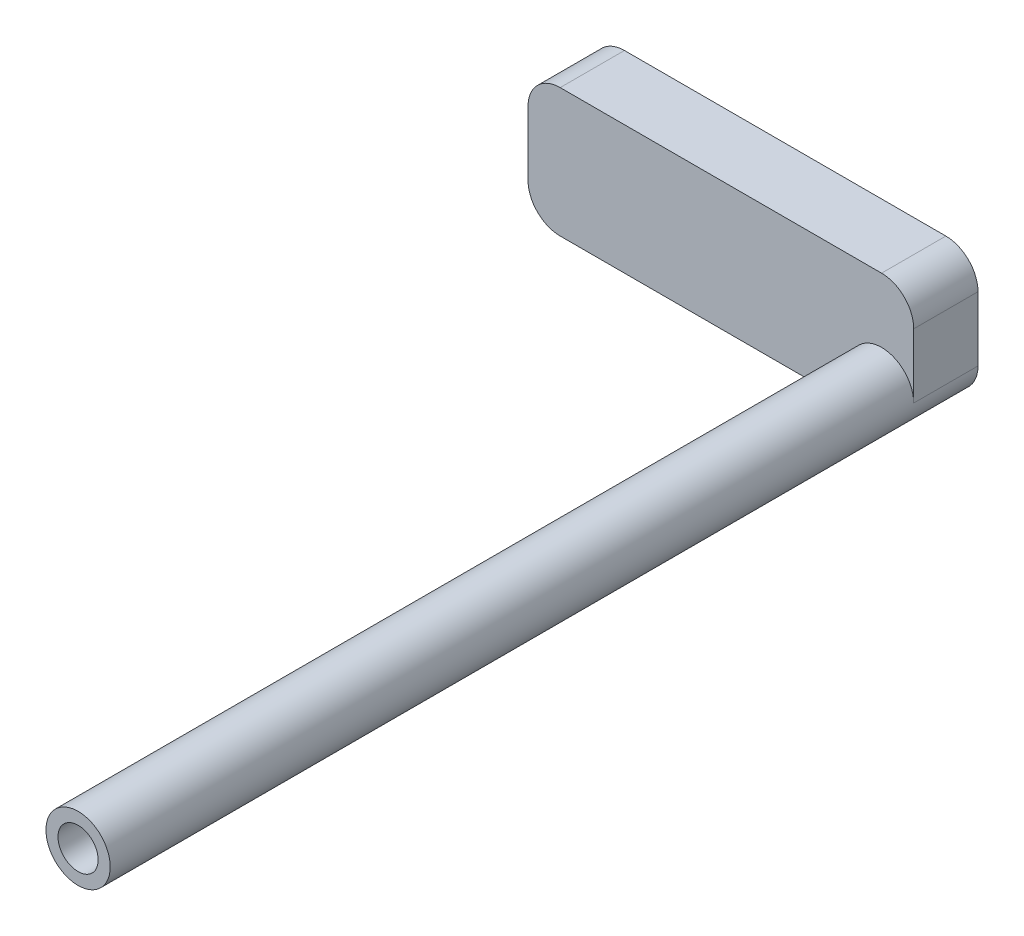
ISO-10303-21;
HEADER;
FILE_DESCRIPTION(('STEP AP214'),'2;1');
FILE_NAME('part.step','',(''),(''),'','','');
FILE_SCHEMA(('AUTOMOTIVE_DESIGN { 1 0 10303 214 1 1 1 1 }'));
ENDSEC;
DATA;
#1=APPLICATION_CONTEXT('core data for automotive mechanical design processes');
#2=APPLICATION_PROTOCOL_DEFINITION('international standard','automotive_design',2000,#1);
#3=PRODUCT_CONTEXT('',#1,'mechanical');
#4=PRODUCT('Part','Part','',(#3));
#5=PRODUCT_RELATED_PRODUCT_CATEGORY('part','',(#4));
#6=PRODUCT_DEFINITION_FORMATION('','',#4);
#7=PRODUCT_DEFINITION_CONTEXT('part definition',#1,'design');
#8=PRODUCT_DEFINITION('design','',#6,#7);
#9=PRODUCT_DEFINITION_SHAPE('','',#8);
#10=(LENGTH_UNIT() NAMED_UNIT(*) SI_UNIT(.MILLI.,.METRE.));
#11=(NAMED_UNIT(*) PLANE_ANGLE_UNIT() SI_UNIT($,.RADIAN.));
#12=(NAMED_UNIT(*) SI_UNIT($,.STERADIAN.) SOLID_ANGLE_UNIT());
#13=UNCERTAINTY_MEASURE_WITH_UNIT(LENGTH_MEASURE(1.E-05),#10,'distance_accuracy_value','');
#14=(GEOMETRIC_REPRESENTATION_CONTEXT(3) GLOBAL_UNCERTAINTY_ASSIGNED_CONTEXT((#13)) GLOBAL_UNIT_ASSIGNED_CONTEXT((#10,
#11,#12)) REPRESENTATION_CONTEXT('',''));
#15=CARTESIAN_POINT('',(0.,0.,0.));
#16=DIRECTION('',(0.,0.,1.));
#17=DIRECTION('',(1.,0.,0.));
#18=AXIS2_PLACEMENT_3D('',#15,#16,#17);
#19=CARTESIAN_POINT('',(0.,0.,5.));
#20=DIRECTION('',(0.,0.,-1.));
#21=DIRECTION('',(-1.,0.,0.));
#22=AXIS2_PLACEMENT_3D('',#19,#20,#21);
#23=CYLINDRICAL_SURFACE('',#22,4.);
#24=CARTESIAN_POINT('',(0.,0.,-100.));
#25=DIRECTION('',(0.,0.,1.));
#26=DIRECTION('',(1.,0.,0.));
#27=AXIS2_PLACEMENT_3D('',#24,#25,#26);
#28=CIRCLE('',#27,4.);
#29=CARTESIAN_POINT('',(4.,0.,-100.));
#30=VERTEX_POINT('',#29);
#31=CARTESIAN_POINT('',(0.,-4.,-100.));
#32=VERTEX_POINT('',#31);
#33=EDGE_CURVE('E11',#30,#32,#28,.T.);
#34=ORIENTED_EDGE('',*,*,#33,.T.);
#35=DIRECTION('',(0.,0.,1.));
#36=VECTOR('',#35,1.);
#37=CARTESIAN_POINT('',(0.,-4.,-108.));
#38=LINE('',#37,#36);
#39=CARTESIAN_POINT('',(0.,-4.,-108.));
#40=VERTEX_POINT('',#39);
#41=EDGE_CURVE('E184',#40,#32,#38,.T.);
#42=ORIENTED_EDGE('',*,*,#41,.F.);
#43=CARTESIAN_POINT('',(0.,0.,-108.));
#44=DIRECTION('',(0.,0.,-1.));
#45=DIRECTION('',(-1.,0.,0.));
#46=AXIS2_PLACEMENT_3D('',#43,#44,#45);
#47=CIRCLE('',#46,4.);
#48=CARTESIAN_POINT('',(4.,0.,-108.));
#49=VERTEX_POINT('',#48);
#50=EDGE_CURVE('E214',#49,#40,#47,.T.);
#51=ORIENTED_EDGE('',*,*,#50,.F.);
#52=DIRECTION('',(0.,0.,1.));
#53=VECTOR('',#52,1.);
#54=CARTESIAN_POINT('',(4.,0.,-108.));
#55=LINE('',#54,#53);
#56=EDGE_CURVE('E60',#49,#30,#55,.T.);
#57=ORIENTED_EDGE('',*,*,#56,.T.);
#58=EDGE_LOOP('',(#34,#42,#51,#57));
#59=FACE_BOUND('',#58,.T.);
#60=CARTESIAN_POINT('',(0.,0.,0.));
#61=DIRECTION('',(0.,0.,1.));
#62=DIRECTION('',(1.,0.,0.));
#63=AXIS2_PLACEMENT_3D('',#60,#61,#62);
#64=CIRCLE('',#63,4.);
#65=CARTESIAN_POINT('',(4.,0.,0.));
#66=VERTEX_POINT('',#65);
#67=EDGE_CURVE('E192',#66,#66,#64,.T.);
#68=ORIENTED_EDGE('',*,*,#67,.F.);
#69=EDGE_LOOP('',(#68));
#70=FACE_BOUND('',#69,.T.);
#71=ADVANCED_FACE('F45',(#59,#70),#23,.T.);
#72=CARTESIAN_POINT('',(0.,0.,-100.));
#73=DIRECTION('',(0.,0.,1.));
#74=DIRECTION('',(1.,0.,0.));
#75=AXIS2_PLACEMENT_3D('',#72,#73,#74);
#76=CYLINDRICAL_SURFACE('',#75,2.5);
#77=CARTESIAN_POINT('',(0.,0.,-100.));
#78=DIRECTION('',(0.,0.,1.));
#79=DIRECTION('',(1.,0.,0.));
#80=AXIS2_PLACEMENT_3D('',#77,#78,#79);
#81=CIRCLE('',#80,2.5);
#82=CARTESIAN_POINT('',(2.5,0.,-100.));
#83=VERTEX_POINT('',#82);
#84=EDGE_CURVE('E54',#83,#83,#81,.T.);
#85=ORIENTED_EDGE('',*,*,#84,.F.);
#86=EDGE_LOOP('',(#85));
#87=FACE_BOUND('',#86,.T.);
#88=CARTESIAN_POINT('',(0.,0.,0.));
#89=DIRECTION('',(0.,0.,1.));
#90=DIRECTION('',(1.,0.,0.));
#91=AXIS2_PLACEMENT_3D('',#88,#89,#90);
#92=CIRCLE('',#91,2.5);
#93=CARTESIAN_POINT('',(2.5,0.,0.));
#94=VERTEX_POINT('',#93);
#95=EDGE_CURVE('E48',#94,#94,#92,.F.);
#96=ORIENTED_EDGE('',*,*,#95,.F.);
#97=EDGE_LOOP('',(#96));
#98=FACE_BOUND('',#97,.T.);
#99=ADVANCED_FACE('F201',(#87,#98),#76,.F.);
#100=CARTESIAN_POINT('',(0.,0.,0.));
#101=DIRECTION('',(0.,0.,1.));
#102=DIRECTION('',(1.,0.,0.));
#103=AXIS2_PLACEMENT_3D('',#100,#101,#102);
#104=PLANE('',#103);
#105=ORIENTED_EDGE('',*,*,#95,.T.);
#106=EDGE_LOOP('',(#105));
#107=FACE_BOUND('',#106,.T.);
#108=ORIENTED_EDGE('',*,*,#67,.T.);
#109=EDGE_LOOP('',(#108));
#110=FACE_BOUND('',#109,.T.);
#111=ADVANCED_FACE('F204',(#107,#110),#104,.T.);
#112=CARTESIAN_POINT('',(0.,8.,-108.));
#113=DIRECTION('',(0.,0.,1.));
#114=DIRECTION('',(1.,0.,0.));
#115=AXIS2_PLACEMENT_3D('',#112,#113,#114);
#116=PLANE('',#115);
#117=CARTESIAN_POINT('',(-20.,0.,-108.));
#118=DIRECTION('',(0.,0.,-1.));
#119=DIRECTION('',(-1.,0.,0.));
#120=AXIS2_PLACEMENT_3D('',#117,#118,#119);
#121=CIRCLE('',#120,3.2);
#122=CARTESIAN_POINT('',(-23.2,0.,-108.));
#123=VERTEX_POINT('',#122);
#124=EDGE_CURVE('E233',#123,#123,#121,.T.);
#125=ORIENTED_EDGE('',*,*,#124,.F.);
#126=EDGE_LOOP('',(#125));
#127=FACE_BOUND('',#126,.T.);
#128=CARTESIAN_POINT('',(-10.,0.,-108.));
#129=DIRECTION('',(0.,0.,-1.));
#130=DIRECTION('',(-1.,0.,0.));
#131=AXIS2_PLACEMENT_3D('',#128,#129,#130);
#132=CIRCLE('',#131,3.2);
#133=CARTESIAN_POINT('',(-13.2,0.,-108.));
#134=VERTEX_POINT('',#133);
#135=EDGE_CURVE('E216',#134,#134,#132,.T.);
#136=ORIENTED_EDGE('',*,*,#135,.F.);
#137=EDGE_LOOP('',(#136));
#138=FACE_BOUND('',#137,.T.);
#139=CARTESIAN_POINT('',(-30.,8.,-108.));
#140=DIRECTION('',(0.,0.,-1.));
#141=DIRECTION('',(-1.,0.,0.));
#142=AXIS2_PLACEMENT_3D('',#139,#140,#141);
#143=CIRCLE('',#142,3.2);
#144=CARTESIAN_POINT('',(-33.2,8.,-108.));
#145=VERTEX_POINT('',#144);
#146=EDGE_CURVE('E646',#145,#145,#143,.T.);
#147=ORIENTED_EDGE('',*,*,#146,.F.);
#148=EDGE_LOOP('',(#147));
#149=FACE_BOUND('',#148,.T.);
#150=CARTESIAN_POINT('',(-20.,8.,-108.));
#151=DIRECTION('',(0.,0.,-1.));
#152=DIRECTION('',(-1.,0.,0.));
#153=AXIS2_PLACEMENT_3D('',#150,#151,#152);
#154=CIRCLE('',#153,3.2);
#155=CARTESIAN_POINT('',(-23.2,8.,-108.));
#156=VERTEX_POINT('',#155);
#157=EDGE_CURVE('E269',#156,#156,#154,.T.);
#158=ORIENTED_EDGE('',*,*,#157,.F.);
#159=EDGE_LOOP('',(#158));
#160=FACE_BOUND('',#159,.T.);
#161=CARTESIAN_POINT('',(-9.99999999999999,8.,-108.));
#162=DIRECTION('',(0.,0.,-1.));
#163=DIRECTION('',(-1.,0.,0.));
#164=AXIS2_PLACEMENT_3D('',#161,#162,#163);
#165=CIRCLE('',#164,3.2);
#166=CARTESIAN_POINT('',(-13.2,8.,-108.));
#167=VERTEX_POINT('',#166);
#168=EDGE_CURVE('E261',#167,#167,#165,.T.);
#169=ORIENTED_EDGE('',*,*,#168,.F.);
#170=EDGE_LOOP('',(#169));
#171=FACE_BOUND('',#170,.T.);
#172=CARTESIAN_POINT('',(0.,0.,-108.));
#173=DIRECTION('',(0.,0.,-1.));
#174=DIRECTION('',(-1.,0.,0.));
#175=AXIS2_PLACEMENT_3D('',#172,#173,#174);
#176=CIRCLE('',#175,3.2);
#177=CARTESIAN_POINT('',(-3.2,0.,-108.));
#178=VERTEX_POINT('',#177);
#179=EDGE_CURVE('E225',#178,#178,#176,.T.);
#180=ORIENTED_EDGE('',*,*,#179,.F.);
#181=EDGE_LOOP('',(#180));
#182=FACE_BOUND('',#181,.T.);
#183=CARTESIAN_POINT('',(-40.,0.,-108.));
#184=DIRECTION('',(0.,0.,-1.));
#185=DIRECTION('',(-1.,0.,0.));
#186=AXIS2_PLACEMENT_3D('',#183,#184,#185);
#187=CIRCLE('',#186,3.2);
#188=CARTESIAN_POINT('',(-43.2,0.,-108.));
#189=VERTEX_POINT('',#188);
#190=EDGE_CURVE('E224',#189,#189,#187,.T.);
#191=ORIENTED_EDGE('',*,*,#190,.F.);
#192=EDGE_LOOP('',(#191));
#193=FACE_BOUND('',#192,.T.);
#194=CARTESIAN_POINT('',(-40.,8.,-108.));
#195=DIRECTION('',(0.,0.,-1.));
#196=DIRECTION('',(-1.,0.,0.));
#197=AXIS2_PLACEMENT_3D('',#194,#195,#196);
#198=CIRCLE('',#197,3.2);
#199=CARTESIAN_POINT('',(-43.2,8.,-108.));
#200=VERTEX_POINT('',#199);
#201=EDGE_CURVE('E247',#200,#200,#198,.T.);
#202=ORIENTED_EDGE('',*,*,#201,.F.);
#203=EDGE_LOOP('',(#202));
#204=FACE_BOUND('',#203,.T.);
#205=CARTESIAN_POINT('',(-30.,0.,-108.));
#206=DIRECTION('',(0.,0.,-1.));
#207=DIRECTION('',(-1.,0.,0.));
#208=AXIS2_PLACEMENT_3D('',#205,#206,#207);
#209=CIRCLE('',#208,3.2);
#210=CARTESIAN_POINT('',(-33.2,0.,-108.));
#211=VERTEX_POINT('',#210);
#212=EDGE_CURVE('E244',#211,#211,#209,.T.);
#213=ORIENTED_EDGE('',*,*,#212,.F.);
#214=EDGE_LOOP('',(#213));
#215=FACE_BOUND('',#214,.T.);
#216=CARTESIAN_POINT('',(0.,8.,-108.));
#217=DIRECTION('',(0.,0.,-1.));
#218=DIRECTION('',(-1.,0.,0.));
#219=AXIS2_PLACEMENT_3D('',#216,#217,#218);
#220=CIRCLE('',#219,3.2);
#221=CARTESIAN_POINT('',(-3.19999999999999,8.,-108.));
#222=VERTEX_POINT('',#221);
#223=EDGE_CURVE('E210',#222,#222,#220,.T.);
#224=ORIENTED_EDGE('',*,*,#223,.F.);
#225=EDGE_LOOP('',(#224));
#226=FACE_BOUND('',#225,.T.);
#227=CARTESIAN_POINT('',(0.,8.,-108.));
#228=DIRECTION('',(0.,0.,-1.));
#229=DIRECTION('',(1.,0.,0.));
#230=AXIS2_PLACEMENT_3D('',#227,#228,#229);
#231=CIRCLE('',#230,3.99999999999999);
#232=CARTESIAN_POINT('',(0.,12.,-108.));
#233=VERTEX_POINT('',#232);
#234=CARTESIAN_POINT('',(4.,8.,-108.));
#235=VERTEX_POINT('',#234);
#236=EDGE_CURVE('E173',#233,#235,#231,.T.);
#237=ORIENTED_EDGE('',*,*,#236,.T.);
#238=DIRECTION('',(0.,-1.,0.));
#239=VECTOR('',#238,1.);
#240=CARTESIAN_POINT('',(4.,8.,-108.));
#241=LINE('',#240,#239);
#242=EDGE_CURVE('E106',#235,#49,#241,.T.);
#243=ORIENTED_EDGE('',*,*,#242,.T.);
#244=ORIENTED_EDGE('',*,*,#50,.T.);
#245=DIRECTION('',(-1.,0.,0.));
#246=VECTOR('',#245,1.);
#247=CARTESIAN_POINT('',(0.,-4.,-108.));
#248=LINE('',#247,#246);
#249=CARTESIAN_POINT('',(-40.,-4.,-108.));
#250=VERTEX_POINT('',#249);
#251=EDGE_CURVE('E212',#40,#250,#248,.T.);
#252=ORIENTED_EDGE('',*,*,#251,.T.);
#253=CARTESIAN_POINT('',(-40.,0.,-108.));
#254=DIRECTION('',(0.,0.,-1.));
#255=DIRECTION('',(-1.,0.,0.));
#256=AXIS2_PLACEMENT_3D('',#253,#254,#255);
#257=CIRCLE('',#256,3.99999999999999);
#258=CARTESIAN_POINT('',(-44.,0.,-108.));
#259=VERTEX_POINT('',#258);
#260=EDGE_CURVE('E126',#250,#259,#257,.T.);
#261=ORIENTED_EDGE('',*,*,#260,.T.);
#262=DIRECTION('',(0.,1.,0.));
#263=VECTOR('',#262,1.);
#264=CARTESIAN_POINT('',(-44.,8.,-108.));
#265=LINE('',#264,#263);
#266=CARTESIAN_POINT('',(-44.,8.,-108.));
#267=VERTEX_POINT('',#266);
#268=EDGE_CURVE('E119',#259,#267,#265,.T.);
#269=ORIENTED_EDGE('',*,*,#268,.T.);
#270=CARTESIAN_POINT('',(-40.,8.,-108.));
#271=DIRECTION('',(0.,0.,-1.));
#272=DIRECTION('',(-1.,0.,0.));
#273=AXIS2_PLACEMENT_3D('',#270,#271,#272);
#274=CIRCLE('',#273,4.);
#275=CARTESIAN_POINT('',(-40.,12.,-108.));
#276=VERTEX_POINT('',#275);
#277=EDGE_CURVE('E123',#267,#276,#274,.T.);
#278=ORIENTED_EDGE('',*,*,#277,.T.);
#279=DIRECTION('',(1.,0.,0.));
#280=VECTOR('',#279,1.);
#281=CARTESIAN_POINT('',(0.,12.,-108.));
#282=LINE('',#281,#280);
#283=EDGE_CURVE('E69',#276,#233,#282,.T.);
#284=ORIENTED_EDGE('',*,*,#283,.T.);
#285=EDGE_LOOP('',(#237,#243,#244,#252,#261,#269,#278,#284));
#286=FACE_BOUND('',#285,.T.);
#287=ADVANCED_FACE('F121',(#127,#138,#149,#160,#171,#182,#193,#204,#215,#226,#286),#116,.F.);
#288=CARTESIAN_POINT('',(0.,12.,-108.));
#289=DIRECTION('',(0.,-1.,0.));
#290=DIRECTION('',(1.,0.,0.));
#291=AXIS2_PLACEMENT_3D('',#288,#289,#290);
#292=PLANE('',#291);
#293=DIRECTION('',(1.,0.,0.));
#294=VECTOR('',#293,1.);
#295=CARTESIAN_POINT('',(0.,12.,-100.));
#296=LINE('',#295,#294);
#297=CARTESIAN_POINT('',(-40.,12.,-100.));
#298=VERTEX_POINT('',#297);
#299=CARTESIAN_POINT('',(0.,12.,-100.));
#300=VERTEX_POINT('',#299);
#301=EDGE_CURVE('E98',#298,#300,#296,.T.);
#302=ORIENTED_EDGE('',*,*,#301,.T.);
#303=DIRECTION('',(0.,0.,1.));
#304=VECTOR('',#303,1.);
#305=CARTESIAN_POINT('',(0.,12.,-108.));
#306=LINE('',#305,#304);
#307=EDGE_CURVE('E149',#233,#300,#306,.T.);
#308=ORIENTED_EDGE('',*,*,#307,.F.);
#309=ORIENTED_EDGE('',*,*,#283,.F.);
#310=DIRECTION('',(0.,0.,1.));
#311=VECTOR('',#310,1.);
#312=CARTESIAN_POINT('',(-40.,12.,-108.));
#313=LINE('',#312,#311);
#314=EDGE_CURVE('E141',#276,#298,#313,.T.);
#315=ORIENTED_EDGE('',*,*,#314,.T.);
#316=EDGE_LOOP('',(#302,#308,#309,#315));
#317=FACE_BOUND('',#316,.T.);
#318=ADVANCED_FACE('F294',(#317),#292,.F.);
#319=CARTESIAN_POINT('',(-40.,8.,-108.));
#320=DIRECTION('',(0.,0.,1.));
#321=DIRECTION('',(1.,0.,0.));
#322=AXIS2_PLACEMENT_3D('',#319,#320,#321);
#323=CYLINDRICAL_SURFACE('',#322,4.);
#324=CARTESIAN_POINT('',(-40.,8.,-100.));
#325=DIRECTION('',(0.,0.,-1.));
#326=DIRECTION('',(-1.,0.,0.));
#327=AXIS2_PLACEMENT_3D('',#324,#325,#326);
#328=CIRCLE('',#327,4.);
#329=CARTESIAN_POINT('',(-44.,8.,-100.));
#330=VERTEX_POINT('',#329);
#331=EDGE_CURVE('E168',#330,#298,#328,.T.);
#332=ORIENTED_EDGE('',*,*,#331,.T.);
#333=ORIENTED_EDGE('',*,*,#314,.F.);
#334=ORIENTED_EDGE('',*,*,#277,.F.);
#335=DIRECTION('',(0.,0.,1.));
#336=VECTOR('',#335,1.);
#337=CARTESIAN_POINT('',(-44.,8.,-108.));
#338=LINE('',#337,#336);
#339=EDGE_CURVE('E133',#267,#330,#338,.T.);
#340=ORIENTED_EDGE('',*,*,#339,.T.);
#341=EDGE_LOOP('',(#332,#333,#334,#340));
#342=FACE_BOUND('',#341,.T.);
#343=ADVANCED_FACE('F143',(#342),#323,.T.);
#344=CARTESIAN_POINT('',(-44.,8.,-108.));
#345=DIRECTION('',(1.,0.,0.));
#346=DIRECTION('',(0.,0.,-1.));
#347=AXIS2_PLACEMENT_3D('',#344,#345,#346);
#348=PLANE('',#347);
#349=DIRECTION('',(0.,1.,0.));
#350=VECTOR('',#349,1.);
#351=CARTESIAN_POINT('',(-44.,8.,-100.));
#352=LINE('',#351,#350);
#353=CARTESIAN_POINT('',(-44.,0.,-100.));
#354=VERTEX_POINT('',#353);
#355=EDGE_CURVE('E136',#354,#330,#352,.T.);
#356=ORIENTED_EDGE('',*,*,#355,.T.);
#357=ORIENTED_EDGE('',*,*,#339,.F.);
#358=ORIENTED_EDGE('',*,*,#268,.F.);
#359=DIRECTION('',(0.,0.,1.));
#360=VECTOR('',#359,1.);
#361=CARTESIAN_POINT('',(-44.,0.,-108.));
#362=LINE('',#361,#360);
#363=EDGE_CURVE('E140',#259,#354,#362,.T.);
#364=ORIENTED_EDGE('',*,*,#363,.T.);
#365=EDGE_LOOP('',(#356,#357,#358,#364));
#366=FACE_BOUND('',#365,.T.);
#367=ADVANCED_FACE('F134',(#366),#348,.F.);
#368=CARTESIAN_POINT('',(-40.,0.,-108.));
#369=DIRECTION('',(0.,0.,1.));
#370=DIRECTION('',(1.,0.,0.));
#371=AXIS2_PLACEMENT_3D('',#368,#369,#370);
#372=CYLINDRICAL_SURFACE('',#371,3.99999999999999);
#373=CARTESIAN_POINT('',(-40.,0.,-100.));
#374=DIRECTION('',(0.,0.,-1.));
#375=DIRECTION('',(-1.,0.,0.));
#376=AXIS2_PLACEMENT_3D('',#373,#374,#375);
#377=CIRCLE('',#376,3.99999999999999);
#378=CARTESIAN_POINT('',(-40.,-4.,-100.));
#379=VERTEX_POINT('',#378);
#380=EDGE_CURVE('E163',#379,#354,#377,.T.);
#381=ORIENTED_EDGE('',*,*,#380,.T.);
#382=ORIENTED_EDGE('',*,*,#363,.F.);
#383=ORIENTED_EDGE('',*,*,#260,.F.);
#384=DIRECTION('',(0.,0.,1.));
#385=VECTOR('',#384,1.);
#386=CARTESIAN_POINT('',(-40.,-4.,-108.));
#387=LINE('',#386,#385);
#388=EDGE_CURVE('E180',#250,#379,#387,.T.);
#389=ORIENTED_EDGE('',*,*,#388,.T.);
#390=EDGE_LOOP('',(#381,#382,#383,#389));
#391=FACE_BOUND('',#390,.T.);
#392=ADVANCED_FACE('F290',(#391),#372,.T.);
#393=CARTESIAN_POINT('',(0.,-4.,-108.));
#394=DIRECTION('',(0.,1.,0.));
#395=DIRECTION('',(-1.,0.,0.));
#396=AXIS2_PLACEMENT_3D('',#393,#394,#395);
#397=PLANE('',#396);
#398=DIRECTION('',(-1.,0.,0.));
#399=VECTOR('',#398,1.);
#400=CARTESIAN_POINT('',(0.,-4.,-100.));
#401=LINE('',#400,#399);
#402=EDGE_CURVE('E161',#32,#379,#401,.T.);
#403=ORIENTED_EDGE('',*,*,#402,.T.);
#404=ORIENTED_EDGE('',*,*,#388,.F.);
#405=ORIENTED_EDGE('',*,*,#251,.F.);
#406=ORIENTED_EDGE('',*,*,#41,.T.);
#407=EDGE_LOOP('',(#403,#404,#405,#406));
#408=FACE_BOUND('',#407,.T.);
#409=ADVANCED_FACE('F287',(#408),#397,.F.);
#410=CARTESIAN_POINT('',(4.,8.,-108.));
#411=DIRECTION('',(-1.,0.,0.));
#412=DIRECTION('',(0.,-1.,0.));
#413=AXIS2_PLACEMENT_3D('',#410,#411,#412);
#414=PLANE('',#413);
#415=DIRECTION('',(0.,-1.,0.));
#416=VECTOR('',#415,1.);
#417=CARTESIAN_POINT('',(4.,8.,-100.));
#418=LINE('',#417,#416);
#419=CARTESIAN_POINT('',(4.,8.,-100.));
#420=VERTEX_POINT('',#419);
#421=EDGE_CURVE('E157',#420,#30,#418,.T.);
#422=ORIENTED_EDGE('',*,*,#421,.T.);
#423=ORIENTED_EDGE('',*,*,#56,.F.);
#424=ORIENTED_EDGE('',*,*,#242,.F.);
#425=DIRECTION('',(0.,0.,1.));
#426=VECTOR('',#425,1.);
#427=CARTESIAN_POINT('',(4.,8.,-108.));
#428=LINE('',#427,#426);
#429=EDGE_CURVE('E189',#235,#420,#428,.T.);
#430=ORIENTED_EDGE('',*,*,#429,.T.);
#431=EDGE_LOOP('',(#422,#423,#424,#430));
#432=FACE_BOUND('',#431,.T.);
#433=ADVANCED_FACE('F299',(#432),#414,.F.);
#434=CARTESIAN_POINT('',(0.,8.,-108.));
#435=DIRECTION('',(0.,0.,1.));
#436=DIRECTION('',(1.,0.,0.));
#437=AXIS2_PLACEMENT_3D('',#434,#435,#436);
#438=CYLINDRICAL_SURFACE('',#437,3.99999999999999);
#439=CARTESIAN_POINT('',(0.,8.,-100.));
#440=DIRECTION('',(0.,0.,-1.));
#441=DIRECTION('',(1.,0.,0.));
#442=AXIS2_PLACEMENT_3D('',#439,#440,#441);
#443=CIRCLE('',#442,3.99999999999999);
#444=EDGE_CURVE('E153',#300,#420,#443,.T.);
#445=ORIENTED_EDGE('',*,*,#444,.T.);
#446=ORIENTED_EDGE('',*,*,#429,.F.);
#447=ORIENTED_EDGE('',*,*,#236,.F.);
#448=ORIENTED_EDGE('',*,*,#307,.T.);
#449=EDGE_LOOP('',(#445,#446,#447,#448));
#450=FACE_BOUND('',#449,.T.);
#451=ADVANCED_FACE('F298',(#450),#438,.T.);
#452=CARTESIAN_POINT('',(0.,8.,-100.));
#453=DIRECTION('',(0.,0.,1.));
#454=DIRECTION('',(1.,0.,0.));
#455=AXIS2_PLACEMENT_3D('',#452,#453,#454);
#456=PLANE('',#455);
#457=ORIENTED_EDGE('',*,*,#33,.F.);
#458=ORIENTED_EDGE('',*,*,#421,.F.);
#459=ORIENTED_EDGE('',*,*,#444,.F.);
#460=ORIENTED_EDGE('',*,*,#301,.F.);
#461=ORIENTED_EDGE('',*,*,#331,.F.);
#462=ORIENTED_EDGE('',*,*,#355,.F.);
#463=ORIENTED_EDGE('',*,*,#380,.F.);
#464=ORIENTED_EDGE('',*,*,#402,.F.);
#465=EDGE_LOOP('',(#457,#458,#459,#460,#461,#462,#463,#464));
#466=FACE_BOUND('',#465,.T.);
#467=ADVANCED_FACE('F292',(#466),#456,.T.);
#468=ORIENTED_EDGE('',*,*,#84,.T.);
#469=EDGE_LOOP('',(#468));
#470=FACE_BOUND('',#469,.T.);
#471=ADVANCED_FACE('F199',(#470),#456,.T.);
#472=CARTESIAN_POINT('',(0.,8.,-104.95));
#473=DIRECTION('',(0.,0.,-1.));
#474=DIRECTION('',(-1.,0.,0.));
#475=AXIS2_PLACEMENT_3D('',#472,#473,#474);
#476=CYLINDRICAL_SURFACE('',#475,3.2);
#477=CARTESIAN_POINT('',(0.,8.,-104.95));
#478=DIRECTION('',(0.,0.,-1.));
#479=DIRECTION('',(-1.,0.,0.));
#480=AXIS2_PLACEMENT_3D('',#477,#478,#479);
#481=CIRCLE('',#480,3.2);
#482=CARTESIAN_POINT('',(-3.19999999999999,8.,-104.95));
#483=VERTEX_POINT('',#482);
#484=EDGE_CURVE('E158',#483,#483,#481,.T.);
#485=ORIENTED_EDGE('',*,*,#484,.F.);
#486=EDGE_LOOP('',(#485));
#487=FACE_BOUND('',#486,.T.);
#488=ORIENTED_EDGE('',*,*,#223,.T.);
#489=EDGE_LOOP('',(#488));
#490=FACE_BOUND('',#489,.T.);
#491=ADVANCED_FACE('F375',(#487,#490),#476,.F.);
#492=CARTESIAN_POINT('',(0.,8.,-104.95));
#493=DIRECTION('',(0.,0.,-1.));
#494=DIRECTION('',(-1.,0.,0.));
#495=AXIS2_PLACEMENT_3D('',#492,#493,#494);
#496=PLANE('',#495);
#497=ORIENTED_EDGE('',*,*,#484,.T.);
#498=EDGE_LOOP('',(#497));
#499=FACE_BOUND('',#498,.T.);
#500=ADVANCED_FACE('F382',(#499),#496,.T.);
#501=CARTESIAN_POINT('',(-30.,0.,-104.95));
#502=DIRECTION('',(0.,0.,-1.));
#503=DIRECTION('',(-1.,0.,0.));
#504=AXIS2_PLACEMENT_3D('',#501,#502,#503);
#505=CYLINDRICAL_SURFACE('',#504,3.2);
#506=CARTESIAN_POINT('',(-30.,0.,-104.95));
#507=DIRECTION('',(0.,0.,-1.));
#508=DIRECTION('',(-1.,0.,0.));
#509=AXIS2_PLACEMENT_3D('',#506,#507,#508);
#510=CIRCLE('',#509,3.2);
#511=CARTESIAN_POINT('',(-33.2,0.,-104.95));
#512=VERTEX_POINT('',#511);
#513=EDGE_CURVE('E665',#512,#512,#510,.T.);
#514=ORIENTED_EDGE('',*,*,#513,.F.);
#515=EDGE_LOOP('',(#514));
#516=FACE_BOUND('',#515,.T.);
#517=ORIENTED_EDGE('',*,*,#212,.T.);
#518=EDGE_LOOP('',(#517));
#519=FACE_BOUND('',#518,.T.);
#520=ADVANCED_FACE('F388',(#516,#519),#505,.F.);
#521=CARTESIAN_POINT('',(-30.,0.,-104.95));
#522=DIRECTION('',(0.,0.,-1.));
#523=DIRECTION('',(-1.,0.,0.));
#524=AXIS2_PLACEMENT_3D('',#521,#522,#523);
#525=PLANE('',#524);
#526=ORIENTED_EDGE('',*,*,#513,.T.);
#527=EDGE_LOOP('',(#526));
#528=FACE_BOUND('',#527,.T.);
#529=ADVANCED_FACE('F395',(#528),#525,.T.);
#530=CARTESIAN_POINT('',(-40.,8.,-104.95));
#531=DIRECTION('',(0.,0.,-1.));
#532=DIRECTION('',(-1.,0.,0.));
#533=AXIS2_PLACEMENT_3D('',#530,#531,#532);
#534=CYLINDRICAL_SURFACE('',#533,3.2);
#535=CARTESIAN_POINT('',(-40.,8.,-104.95));
#536=DIRECTION('',(0.,0.,-1.));
#537=DIRECTION('',(-1.,0.,0.));
#538=AXIS2_PLACEMENT_3D('',#535,#536,#537);
#539=CIRCLE('',#538,3.2);
#540=CARTESIAN_POINT('',(-43.2,8.,-104.95));
#541=VERTEX_POINT('',#540);
#542=EDGE_CURVE('E251',#541,#541,#539,.T.);
#543=ORIENTED_EDGE('',*,*,#542,.F.);
#544=EDGE_LOOP('',(#543));
#545=FACE_BOUND('',#544,.T.);
#546=ORIENTED_EDGE('',*,*,#201,.T.);
#547=EDGE_LOOP('',(#546));
#548=FACE_BOUND('',#547,.T.);
#549=ADVANCED_FACE('F402',(#545,#548),#534,.F.);
#550=CARTESIAN_POINT('',(-40.,8.,-104.95));
#551=DIRECTION('',(0.,0.,-1.));
#552=DIRECTION('',(-1.,0.,0.));
#553=AXIS2_PLACEMENT_3D('',#550,#551,#552);
#554=PLANE('',#553);
#555=ORIENTED_EDGE('',*,*,#542,.T.);
#556=EDGE_LOOP('',(#555));
#557=FACE_BOUND('',#556,.T.);
#558=ADVANCED_FACE('F409',(#557),#554,.T.);
#559=CARTESIAN_POINT('',(-40.,0.,-104.95));
#560=DIRECTION('',(0.,0.,-1.));
#561=DIRECTION('',(-1.,0.,0.));
#562=AXIS2_PLACEMENT_3D('',#559,#560,#561);
#563=CYLINDRICAL_SURFACE('',#562,3.2);
#564=CARTESIAN_POINT('',(-40.,0.,-104.95));
#565=DIRECTION('',(0.,0.,-1.));
#566=DIRECTION('',(-1.,0.,0.));
#567=AXIS2_PLACEMENT_3D('',#564,#565,#566);
#568=CIRCLE('',#567,3.2);
#569=CARTESIAN_POINT('',(-43.2,0.,-104.95));
#570=VERTEX_POINT('',#569);
#571=EDGE_CURVE('E222',#570,#570,#568,.T.);
#572=ORIENTED_EDGE('',*,*,#571,.F.);
#573=EDGE_LOOP('',(#572));
#574=FACE_BOUND('',#573,.T.);
#575=ORIENTED_EDGE('',*,*,#190,.T.);
#576=EDGE_LOOP('',(#575));
#577=FACE_BOUND('',#576,.T.);
#578=ADVANCED_FACE('F416',(#574,#577),#563,.F.);
#579=CARTESIAN_POINT('',(-40.,0.,-104.95));
#580=DIRECTION('',(0.,0.,-1.));
#581=DIRECTION('',(-1.,0.,0.));
#582=AXIS2_PLACEMENT_3D('',#579,#580,#581);
#583=PLANE('',#582);
#584=ORIENTED_EDGE('',*,*,#571,.T.);
#585=EDGE_LOOP('',(#584));
#586=FACE_BOUND('',#585,.T.);
#587=ADVANCED_FACE('F423',(#586),#583,.T.);
#588=CARTESIAN_POINT('',(0.,0.,-104.95));
#589=DIRECTION('',(0.,0.,-1.));
#590=DIRECTION('',(-1.,0.,0.));
#591=AXIS2_PLACEMENT_3D('',#588,#589,#590);
#592=CYLINDRICAL_SURFACE('',#591,3.2);
#593=CARTESIAN_POINT('',(0.,0.,-104.95));
#594=DIRECTION('',(0.,0.,-1.));
#595=DIRECTION('',(-1.,0.,0.));
#596=AXIS2_PLACEMENT_3D('',#593,#594,#595);
#597=CIRCLE('',#596,3.2);
#598=CARTESIAN_POINT('',(-3.2,0.,-104.95));
#599=VERTEX_POINT('',#598);
#600=EDGE_CURVE('E231',#599,#599,#597,.T.);
#601=ORIENTED_EDGE('',*,*,#600,.F.);
#602=EDGE_LOOP('',(#601));
#603=FACE_BOUND('',#602,.T.);
#604=ORIENTED_EDGE('',*,*,#179,.T.);
#605=EDGE_LOOP('',(#604));
#606=FACE_BOUND('',#605,.T.);
#607=ADVANCED_FACE('F430',(#603,#606),#592,.F.);
#608=CARTESIAN_POINT('',(0.,0.,-104.95));
#609=DIRECTION('',(0.,0.,-1.));
#610=DIRECTION('',(-1.,0.,0.));
#611=AXIS2_PLACEMENT_3D('',#608,#609,#610);
#612=PLANE('',#611);
#613=ORIENTED_EDGE('',*,*,#600,.T.);
#614=EDGE_LOOP('',(#613));
#615=FACE_BOUND('',#614,.T.);
#616=ADVANCED_FACE('F437',(#615),#612,.T.);
#617=CARTESIAN_POINT('',(-9.99999999999999,8.,-104.95));
#618=DIRECTION('',(0.,0.,-1.));
#619=DIRECTION('',(-1.,0.,0.));
#620=AXIS2_PLACEMENT_3D('',#617,#618,#619);
#621=CYLINDRICAL_SURFACE('',#620,3.2);
#622=CARTESIAN_POINT('',(-9.99999999999999,8.,-104.95));
#623=DIRECTION('',(0.,0.,-1.));
#624=DIRECTION('',(-1.,0.,0.));
#625=AXIS2_PLACEMENT_3D('',#622,#623,#624);
#626=CIRCLE('',#625,3.2);
#627=CARTESIAN_POINT('',(-13.2,8.,-104.95));
#628=VERTEX_POINT('',#627);
#629=EDGE_CURVE('E265',#628,#628,#626,.T.);
#630=ORIENTED_EDGE('',*,*,#629,.F.);
#631=EDGE_LOOP('',(#630));
#632=FACE_BOUND('',#631,.T.);
#633=ORIENTED_EDGE('',*,*,#168,.T.);
#634=EDGE_LOOP('',(#633));
#635=FACE_BOUND('',#634,.T.);
#636=ADVANCED_FACE('F444',(#632,#635),#621,.F.);
#637=CARTESIAN_POINT('',(-9.99999999999999,8.,-104.95));
#638=DIRECTION('',(0.,0.,-1.));
#639=DIRECTION('',(-1.,0.,0.));
#640=AXIS2_PLACEMENT_3D('',#637,#638,#639);
#641=PLANE('',#640);
#642=ORIENTED_EDGE('',*,*,#629,.T.);
#643=EDGE_LOOP('',(#642));
#644=FACE_BOUND('',#643,.T.);
#645=ADVANCED_FACE('F451',(#644),#641,.T.);
#646=CARTESIAN_POINT('',(-20.,8.,-104.95));
#647=DIRECTION('',(0.,0.,-1.));
#648=DIRECTION('',(-1.,0.,0.));
#649=AXIS2_PLACEMENT_3D('',#646,#647,#648);
#650=CYLINDRICAL_SURFACE('',#649,3.2);
#651=CARTESIAN_POINT('',(-20.,8.,-104.95));
#652=DIRECTION('',(0.,0.,-1.));
#653=DIRECTION('',(-1.,0.,0.));
#654=AXIS2_PLACEMENT_3D('',#651,#652,#653);
#655=CIRCLE('',#654,3.2);
#656=CARTESIAN_POINT('',(-23.2,8.,-104.95));
#657=VERTEX_POINT('',#656);
#658=EDGE_CURVE('E674',#657,#657,#655,.T.);
#659=ORIENTED_EDGE('',*,*,#658,.F.);
#660=EDGE_LOOP('',(#659));
#661=FACE_BOUND('',#660,.T.);
#662=ORIENTED_EDGE('',*,*,#157,.T.);
#663=EDGE_LOOP('',(#662));
#664=FACE_BOUND('',#663,.T.);
#665=ADVANCED_FACE('F458',(#661,#664),#650,.F.);
#666=CARTESIAN_POINT('',(-20.,8.,-104.95));
#667=DIRECTION('',(0.,0.,-1.));
#668=DIRECTION('',(-1.,0.,0.));
#669=AXIS2_PLACEMENT_3D('',#666,#667,#668);
#670=PLANE('',#669);
#671=ORIENTED_EDGE('',*,*,#658,.T.);
#672=EDGE_LOOP('',(#671));
#673=FACE_BOUND('',#672,.T.);
#674=ADVANCED_FACE('F465',(#673),#670,.T.);
#675=CARTESIAN_POINT('',(-30.,8.,-104.95));
#676=DIRECTION('',(0.,0.,-1.));
#677=DIRECTION('',(-1.,0.,0.));
#678=AXIS2_PLACEMENT_3D('',#675,#676,#677);
#679=CYLINDRICAL_SURFACE('',#678,3.2);
#680=CARTESIAN_POINT('',(-30.,8.,-104.95));
#681=DIRECTION('',(0.,0.,-1.));
#682=DIRECTION('',(-1.,0.,0.));
#683=AXIS2_PLACEMENT_3D('',#680,#681,#682);
#684=CIRCLE('',#683,3.2);
#685=CARTESIAN_POINT('',(-33.2,8.,-104.95));
#686=VERTEX_POINT('',#685);
#687=EDGE_CURVE('E219',#686,#686,#684,.T.);
#688=ORIENTED_EDGE('',*,*,#687,.F.);
#689=EDGE_LOOP('',(#688));
#690=FACE_BOUND('',#689,.T.);
#691=ORIENTED_EDGE('',*,*,#146,.T.);
#692=EDGE_LOOP('',(#691));
#693=FACE_BOUND('',#692,.T.);
#694=ADVANCED_FACE('F472',(#690,#693),#679,.F.);
#695=CARTESIAN_POINT('',(-30.,8.,-104.95));
#696=DIRECTION('',(0.,0.,-1.));
#697=DIRECTION('',(-1.,0.,0.));
#698=AXIS2_PLACEMENT_3D('',#695,#696,#697);
#699=PLANE('',#698);
#700=ORIENTED_EDGE('',*,*,#687,.T.);
#701=EDGE_LOOP('',(#700));
#702=FACE_BOUND('',#701,.T.);
#703=ADVANCED_FACE('F479',(#702),#699,.T.);
#704=CARTESIAN_POINT('',(-10.,0.,-104.95));
#705=DIRECTION('',(0.,0.,-1.));
#706=DIRECTION('',(-1.,0.,0.));
#707=AXIS2_PLACEMENT_3D('',#704,#705,#706);
#708=CYLINDRICAL_SURFACE('',#707,3.2);
#709=CARTESIAN_POINT('',(-10.,0.,-104.95));
#710=DIRECTION('',(0.,0.,-1.));
#711=DIRECTION('',(-1.,0.,0.));
#712=AXIS2_PLACEMENT_3D('',#709,#710,#711);
#713=CIRCLE('',#712,3.2);
#714=CARTESIAN_POINT('',(-13.2,0.,-104.95));
#715=VERTEX_POINT('',#714);
#716=EDGE_CURVE('E220',#715,#715,#713,.T.);
#717=ORIENTED_EDGE('',*,*,#716,.F.);
#718=EDGE_LOOP('',(#717));
#719=FACE_BOUND('',#718,.T.);
#720=ORIENTED_EDGE('',*,*,#135,.T.);
#721=EDGE_LOOP('',(#720));
#722=FACE_BOUND('',#721,.T.);
#723=ADVANCED_FACE('F486',(#719,#722),#708,.F.);
#724=CARTESIAN_POINT('',(-10.,0.,-104.95));
#725=DIRECTION('',(0.,0.,-1.));
#726=DIRECTION('',(-1.,0.,0.));
#727=AXIS2_PLACEMENT_3D('',#724,#725,#726);
#728=PLANE('',#727);
#729=ORIENTED_EDGE('',*,*,#716,.T.);
#730=EDGE_LOOP('',(#729));
#731=FACE_BOUND('',#730,.T.);
#732=ADVANCED_FACE('F493',(#731),#728,.T.);
#733=CARTESIAN_POINT('',(-20.,0.,-104.95));
#734=DIRECTION('',(0.,0.,-1.));
#735=DIRECTION('',(-1.,0.,0.));
#736=AXIS2_PLACEMENT_3D('',#733,#734,#735);
#737=CYLINDRICAL_SURFACE('',#736,3.2);
#738=CARTESIAN_POINT('',(-20.,0.,-104.95));
#739=DIRECTION('',(0.,0.,-1.));
#740=DIRECTION('',(-1.,0.,0.));
#741=AXIS2_PLACEMENT_3D('',#738,#739,#740);
#742=CIRCLE('',#741,3.2);
#743=CARTESIAN_POINT('',(-23.2,0.,-104.95));
#744=VERTEX_POINT('',#743);
#745=EDGE_CURVE('E235',#744,#744,#742,.T.);
#746=ORIENTED_EDGE('',*,*,#745,.F.);
#747=EDGE_LOOP('',(#746));
#748=FACE_BOUND('',#747,.T.);
#749=ORIENTED_EDGE('',*,*,#124,.T.);
#750=EDGE_LOOP('',(#749));
#751=FACE_BOUND('',#750,.T.);
#752=ADVANCED_FACE('F500',(#748,#751),#737,.F.);
#753=CARTESIAN_POINT('',(-20.,0.,-104.95));
#754=DIRECTION('',(0.,0.,-1.));
#755=DIRECTION('',(-1.,0.,0.));
#756=AXIS2_PLACEMENT_3D('',#753,#754,#755);
#757=PLANE('',#756);
#758=ORIENTED_EDGE('',*,*,#745,.T.);
#759=EDGE_LOOP('',(#758));
#760=FACE_BOUND('',#759,.T.);
#761=ADVANCED_FACE('F507',(#760),#757,.T.);
#762=CLOSED_SHELL('',(#71,#99,#111,#287,#318,#343,#367,#392,#409,#433,#451,#467,#471,#491,#500,
#520,#529,#549,#558,#578,#587,#607,#616,#636,#645,#665,#674,#694,#703,#723,#732,#752,#761));
#763=MANIFOLD_SOLID_BREP('B2',#762);
#764=ADVANCED_BREP_SHAPE_REPRESENTATION('',(#18,#763),#14);
#765=SHAPE_DEFINITION_REPRESENTATION(#9,#764);
ENDSEC;
END-ISO-10303-21;
